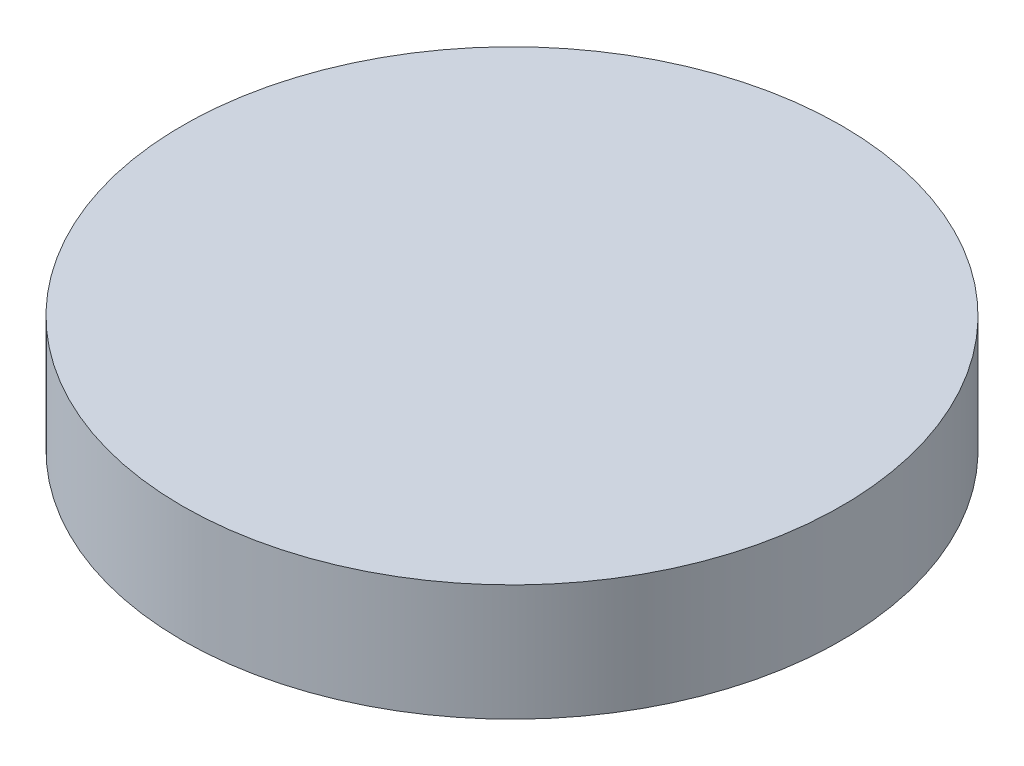
ISO-10303-21;
HEADER;
FILE_DESCRIPTION(('STEP AP214'),'2;1');
FILE_NAME('part.step','',(''),(''),'','','');
FILE_SCHEMA(('AUTOMOTIVE_DESIGN { 1 0 10303 214 1 1 1 1 }'));
ENDSEC;
DATA;
#1=APPLICATION_CONTEXT('core data for automotive mechanical design processes');
#2=APPLICATION_PROTOCOL_DEFINITION('international standard','automotive_design',2000,#1);
#3=PRODUCT_CONTEXT('',#1,'mechanical');
#4=PRODUCT('Part','Part','',(#3));
#5=PRODUCT_RELATED_PRODUCT_CATEGORY('part','',(#4));
#6=PRODUCT_DEFINITION_FORMATION('','',#4);
#7=PRODUCT_DEFINITION_CONTEXT('part definition',#1,'design');
#8=PRODUCT_DEFINITION('design','',#6,#7);
#9=PRODUCT_DEFINITION_SHAPE('','',#8);
#10=(LENGTH_UNIT() NAMED_UNIT(*) SI_UNIT(.MILLI.,.METRE.));
#11=(NAMED_UNIT(*) PLANE_ANGLE_UNIT() SI_UNIT($,.RADIAN.));
#12=(NAMED_UNIT(*) SI_UNIT($,.STERADIAN.) SOLID_ANGLE_UNIT());
#13=UNCERTAINTY_MEASURE_WITH_UNIT(LENGTH_MEASURE(1.E-05),#10,'distance_accuracy_value','');
#14=(GEOMETRIC_REPRESENTATION_CONTEXT(3) GLOBAL_UNCERTAINTY_ASSIGNED_CONTEXT((#13)) GLOBAL_UNIT_ASSIGNED_CONTEXT((#10,
#11,#12)) REPRESENTATION_CONTEXT('',''));
#15=CARTESIAN_POINT('',(0.,0.,0.));
#16=DIRECTION('',(0.,0.,1.));
#17=DIRECTION('',(1.,0.,0.));
#18=AXIS2_PLACEMENT_3D('',#15,#16,#17);
#19=CARTESIAN_POINT('',(0.,19.05,0.));
#20=DIRECTION('',(0.,-1.,0.));
#21=DIRECTION('',(0.,0.,-1.));
#22=AXIS2_PLACEMENT_3D('',#19,#20,#21);
#23=CYLINDRICAL_SURFACE('',#22,53.975);
#24=CARTESIAN_POINT('',(0.,19.05,0.));
#25=DIRECTION('',(0.,1.,0.));
#26=DIRECTION('',(0.,0.,1.));
#27=AXIS2_PLACEMENT_3D('',#24,#25,#26);
#28=CIRCLE('',#27,53.975);
#29=CARTESIAN_POINT('',(0.,19.05,-53.975));
#30=VERTEX_POINT('',#29);
#31=EDGE_CURVE('E10',#30,#30,#28,.T.);
#32=CARTESIAN_POINT('',(0.,0.,0.));
#33=DIRECTION('',(0.,1.,0.));
#34=DIRECTION('',(0.,0.,1.));
#35=AXIS2_PLACEMENT_3D('',#32,#33,#34);
#36=CIRCLE('',#35,53.975);
#37=CARTESIAN_POINT('',(0.,0.,-53.975));
#38=VERTEX_POINT('',#37);
#39=EDGE_CURVE('E33',#38,#38,#36,.T.);
#40=CARTESIAN_POINT('',(0.,19.05,-53.975));
#41=CARTESIAN_POINT('',(0.,18.8515625,-53.975));
#42=CARTESIAN_POINT('',(0.,18.653125,-53.975));
#43=CARTESIAN_POINT('',(0.,18.25625,-53.975));
#44=CARTESIAN_POINT('',(0.,18.0578125,-53.975));
#45=CARTESIAN_POINT('',(0.,17.6609375,-53.975));
#46=CARTESIAN_POINT('',(0.,17.4625,-53.975));
#47=CARTESIAN_POINT('',(0.,17.065625,-53.975));
#48=CARTESIAN_POINT('',(0.,16.8671875,-53.975));
#49=CARTESIAN_POINT('',(0.,16.4703125,-53.975));
#50=CARTESIAN_POINT('',(0.,16.271875,-53.975));
#51=CARTESIAN_POINT('',(0.,15.875,-53.975));
#52=CARTESIAN_POINT('',(0.,15.6765625,-53.975));
#53=CARTESIAN_POINT('',(0.,15.2796875,-53.975));
#54=CARTESIAN_POINT('',(0.,15.08125,-53.975));
#55=CARTESIAN_POINT('',(0.,14.684375,-53.975));
#56=CARTESIAN_POINT('',(0.,14.4859375,-53.975));
#57=CARTESIAN_POINT('',(0.,14.0890625,-53.975));
#58=CARTESIAN_POINT('',(0.,13.890625,-53.975));
#59=CARTESIAN_POINT('',(0.,13.49375,-53.975));
#60=CARTESIAN_POINT('',(0.,13.2953125,-53.975));
#61=CARTESIAN_POINT('',(0.,12.8984375,-53.975));
#62=CARTESIAN_POINT('',(0.,12.7,-53.975));
#63=CARTESIAN_POINT('',(0.,12.303125,-53.975));
#64=CARTESIAN_POINT('',(0.,12.1046875,-53.975));
#65=CARTESIAN_POINT('',(0.,11.7078125,-53.975));
#66=CARTESIAN_POINT('',(0.,11.509375,-53.975));
#67=CARTESIAN_POINT('',(0.,11.1125,-53.975));
#68=CARTESIAN_POINT('',(0.,10.9140625,-53.975));
#69=CARTESIAN_POINT('',(0.,10.5171875,-53.975));
#70=CARTESIAN_POINT('',(0.,10.31875,-53.975));
#71=CARTESIAN_POINT('',(0.,9.921875,-53.975));
#72=CARTESIAN_POINT('',(0.,9.7234375,-53.975));
#73=CARTESIAN_POINT('',(0.,9.3265625,-53.975));
#74=CARTESIAN_POINT('',(0.,9.128125,-53.975));
#75=CARTESIAN_POINT('',(0.,8.73125,-53.975));
#76=CARTESIAN_POINT('',(0.,8.5328125,-53.975));
#77=CARTESIAN_POINT('',(0.,8.1359375,-53.975));
#78=CARTESIAN_POINT('',(0.,7.9375,-53.975));
#79=CARTESIAN_POINT('',(0.,7.540625,-53.975));
#80=CARTESIAN_POINT('',(0.,7.3421875,-53.975));
#81=CARTESIAN_POINT('',(0.,6.9453125,-53.975));
#82=CARTESIAN_POINT('',(0.,6.746875,-53.975));
#83=CARTESIAN_POINT('',(0.,6.35,-53.975));
#84=CARTESIAN_POINT('',(0.,6.1515625,-53.975));
#85=CARTESIAN_POINT('',(0.,5.7546875,-53.975));
#86=CARTESIAN_POINT('',(0.,5.55625,-53.975));
#87=CARTESIAN_POINT('',(0.,5.159375,-53.975));
#88=CARTESIAN_POINT('',(0.,4.9609375,-53.975));
#89=CARTESIAN_POINT('',(0.,4.5640625,-53.975));
#90=CARTESIAN_POINT('',(0.,4.365625,-53.975));
#91=CARTESIAN_POINT('',(0.,3.96875,-53.975));
#92=CARTESIAN_POINT('',(0.,3.7703125,-53.975));
#93=CARTESIAN_POINT('',(0.,3.3734375,-53.975));
#94=CARTESIAN_POINT('',(0.,3.175,-53.975));
#95=CARTESIAN_POINT('',(0.,2.778125,-53.975));
#96=CARTESIAN_POINT('',(0.,2.5796875,-53.975));
#97=CARTESIAN_POINT('',(0.,2.1828125,-53.975));
#98=CARTESIAN_POINT('',(0.,1.984375,-53.975));
#99=CARTESIAN_POINT('',(0.,1.5875,-53.975));
#100=CARTESIAN_POINT('',(0.,1.3890625,-53.975));
#101=CARTESIAN_POINT('',(0.,0.992187500000001,-53.975));
#102=CARTESIAN_POINT('',(0.,0.793750000000001,-53.975));
#103=CARTESIAN_POINT('',(0.,0.396875,-53.975));
#104=CARTESIAN_POINT('',(0.,0.1984375,-53.975));
#105=CARTESIAN_POINT('',(0.,0.,-53.975));
#106=B_SPLINE_CURVE_WITH_KNOTS('',3,(#40,#41,#42,#43,#44,#45,#46,#47,#48,#49,#50,#51,#52,#53,
#54,#55,#56,#57,#58,#59,#60,#61,#62,#63,#64,#65,#66,#67,#68,#69,#70,#71,#72,#73,#74,#75,#76,#77,
#78,#79,#80,#81,#82,#83,#84,#85,#86,#87,#88,#89,#90,#91,#92,#93,#94,#95,#96,#97,#98,#99,#100,
#101,#102,#103,#104,#105),.UNSPECIFIED.,.F.,.F.,(4,2,2,2,2,2,2,2,2,2,2,2,2,2,2,2,2,2,2,2,2,2,2,
2,2,2,2,2,2,2,2,2,4),(0.,0.595312499999997,1.190625,1.7859375,2.38125,2.9765625,3.571875,
4.1671875,4.7625,5.3578125,5.953125,6.5484375,7.14375,7.7390625,8.334375,8.9296875,9.525,
10.1203125,10.715625,11.3109375,11.90625,12.5015625,13.096875,13.6921875,14.2875,14.8828125,
15.478125,16.0734375,16.66875,17.2640625,17.859375,18.4546875,19.05),.UNSPECIFIED.);
#107=EDGE_CURVE('BSEAM30',#30,#38,#106,.T.);
#108=ORIENTED_EDGE('',*,*,#31,.F.);
#109=ORIENTED_EDGE('',*,*,#39,.T.);
#110=ORIENTED_EDGE('',*,*,#107,.T.);
#111=ORIENTED_EDGE('',*,*,#107,.F.);
#112=EDGE_LOOP('',(#108,#110,#109,#111));
#113=FACE_BOUND('',#112,.T.);
#114=ADVANCED_FACE('F30',(#113),#23,.T.);
#115=CARTESIAN_POINT('',(0.,19.05,0.));
#116=DIRECTION('',(0.,1.,0.));
#117=DIRECTION('',(0.,0.,1.));
#118=AXIS2_PLACEMENT_3D('',#115,#116,#117);
#119=PLANE('',#118);
#120=ORIENTED_EDGE('',*,*,#31,.T.);
#121=EDGE_LOOP('',(#120));
#122=FACE_BOUND('',#121,.T.);
#123=ADVANCED_FACE('F51',(#122),#119,.T.);
#124=CARTESIAN_POINT('',(0.,0.,0.));
#125=DIRECTION('',(0.,1.,0.));
#126=DIRECTION('',(0.,0.,1.));
#127=AXIS2_PLACEMENT_3D('',#124,#125,#126);
#128=PLANE('',#127);
#129=ORIENTED_EDGE('',*,*,#39,.F.);
#130=EDGE_LOOP('',(#129));
#131=FACE_BOUND('',#130,.T.);
#132=ADVANCED_FACE('F49',(#131),#128,.F.);
#133=CLOSED_SHELL('',(#114,#123,#132));
#134=MANIFOLD_SOLID_BREP('B2',#133);
#135=ADVANCED_BREP_SHAPE_REPRESENTATION('',(#18,#134),#14);
#136=SHAPE_DEFINITION_REPRESENTATION(#9,#135);
ENDSEC;
END-ISO-10303-21;
